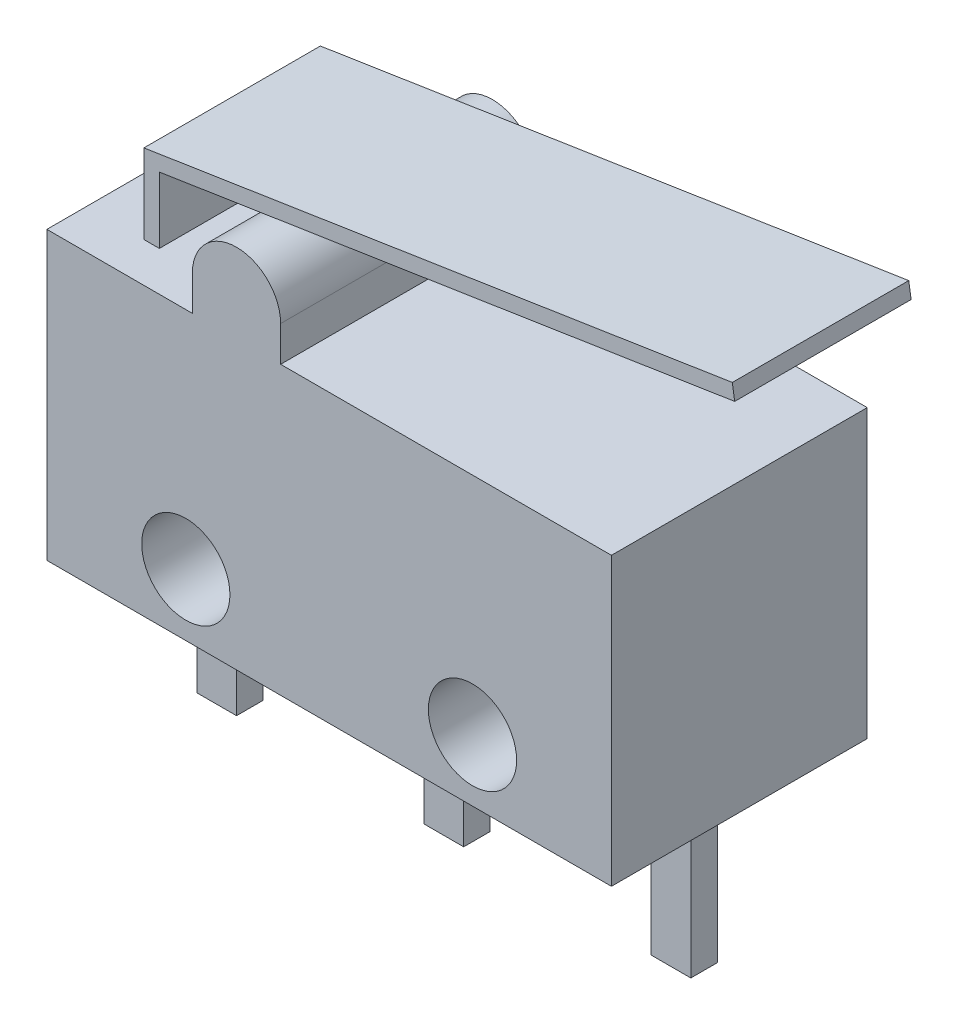
ISO-10303-21;
HEADER;
FILE_DESCRIPTION(('STEP AP214'),'2;1');
FILE_NAME('part.step','',(''),(''),'','','');
FILE_SCHEMA(('AUTOMOTIVE_DESIGN { 1 0 10303 214 1 1 1 1 }'));
ENDSEC;
DATA;
#1=APPLICATION_CONTEXT('core data for automotive mechanical design processes');
#2=APPLICATION_PROTOCOL_DEFINITION('international standard','automotive_design',2000,#1);
#3=PRODUCT_CONTEXT('',#1,'mechanical');
#4=PRODUCT('Part','Part','',(#3));
#5=PRODUCT_RELATED_PRODUCT_CATEGORY('part','',(#4));
#6=PRODUCT_DEFINITION_FORMATION('','',#4);
#7=PRODUCT_DEFINITION_CONTEXT('part definition',#1,'design');
#8=PRODUCT_DEFINITION('design','',#6,#7);
#9=PRODUCT_DEFINITION_SHAPE('','',#8);
#10=(LENGTH_UNIT() NAMED_UNIT(*) SI_UNIT(.MILLI.,.METRE.));
#11=(NAMED_UNIT(*) PLANE_ANGLE_UNIT() SI_UNIT($,.RADIAN.));
#12=(NAMED_UNIT(*) SI_UNIT($,.STERADIAN.) SOLID_ANGLE_UNIT());
#13=UNCERTAINTY_MEASURE_WITH_UNIT(LENGTH_MEASURE(1.E-05),#10,'distance_accuracy_value','');
#14=(GEOMETRIC_REPRESENTATION_CONTEXT(3) GLOBAL_UNCERTAINTY_ASSIGNED_CONTEXT((#13)) GLOBAL_UNIT_ASSIGNED_CONTEXT((#10,
#11,#12)) REPRESENTATION_CONTEXT('',''));
#15=CARTESIAN_POINT('',(0.,0.,0.));
#16=DIRECTION('',(0.,0.,1.));
#17=DIRECTION('',(1.,0.,0.));
#18=AXIS2_PLACEMENT_3D('',#15,#16,#17);
#19=CARTESIAN_POINT('',(0.,6.5,0.));
#20=DIRECTION('',(0.,-1.,0.));
#21=DIRECTION('',(0.,0.,-1.));
#22=AXIS2_PLACEMENT_3D('',#19,#20,#21);
#23=PLANE('',#22);
#24=DIRECTION('',(0.,0.,1.));
#25=VECTOR('',#24,1.);
#26=CARTESIAN_POINT('',(-3.1,6.5,-2.9));
#27=LINE('',#26,#25);
#28=CARTESIAN_POINT('',(-3.1,6.5,-2.9));
#29=VERTEX_POINT('',#28);
#30=CARTESIAN_POINT('',(-3.1,6.5,2.9));
#31=VERTEX_POINT('',#30);
#32=EDGE_CURVE('E270',#29,#31,#27,.T.);
#33=ORIENTED_EDGE('',*,*,#32,.F.);
#34=DIRECTION('',(-1.,0.,0.));
#35=VECTOR('',#34,1.);
#36=CARTESIAN_POINT('',(-6.4,6.5,-2.9));
#37=LINE('',#36,#35);
#38=CARTESIAN_POINT('',(-6.4,6.5,-2.9));
#39=VERTEX_POINT('',#38);
#40=EDGE_CURVE('E425',#29,#39,#37,.T.);
#41=ORIENTED_EDGE('',*,*,#40,.T.);
#42=DIRECTION('',(0.,0.,1.));
#43=VECTOR('',#42,1.);
#44=CARTESIAN_POINT('',(-6.4,6.5,2.9));
#45=LINE('',#44,#43);
#46=CARTESIAN_POINT('',(-6.4,6.5,2.9));
#47=VERTEX_POINT('',#46);
#48=EDGE_CURVE('E431',#39,#47,#45,.T.);
#49=ORIENTED_EDGE('',*,*,#48,.T.);
#50=DIRECTION('',(1.,0.,0.));
#51=VECTOR('',#50,1.);
#52=CARTESIAN_POINT('',(-6.4,6.5,2.9));
#53=LINE('',#52,#51);
#54=EDGE_CURVE('E435',#47,#31,#53,.T.);
#55=ORIENTED_EDGE('',*,*,#54,.T.);
#56=EDGE_LOOP('',(#33,#41,#49,#55));
#57=FACE_BOUND('',#56,.T.);
#58=DIRECTION('',(1.,0.,0.));
#59=VECTOR('',#58,1.);
#60=CARTESIAN_POINT('',(-4.75,6.5,2.));
#61=LINE('',#60,#59);
#62=CARTESIAN_POINT('',(-5.1,6.5,2.));
#63=VERTEX_POINT('',#62);
#64=CARTESIAN_POINT('',(-4.75,6.5,2.));
#65=VERTEX_POINT('',#64);
#66=EDGE_CURVE('E226',#63,#65,#61,.T.);
#67=ORIENTED_EDGE('',*,*,#66,.F.);
#68=DIRECTION('',(0.,0.,-1.));
#69=VECTOR('',#68,1.);
#70=CARTESIAN_POINT('',(-5.1,6.5,2.));
#71=LINE('',#70,#69);
#72=CARTESIAN_POINT('',(-5.1,6.5,-2.));
#73=VERTEX_POINT('',#72);
#74=EDGE_CURVE('E843',#63,#73,#71,.T.);
#75=ORIENTED_EDGE('',*,*,#74,.T.);
#76=DIRECTION('',(1.,0.,0.));
#77=VECTOR('',#76,1.);
#78=CARTESIAN_POINT('',(-4.75,6.5,-2.));
#79=LINE('',#78,#77);
#80=CARTESIAN_POINT('',(-4.75,6.5,-2.));
#81=VERTEX_POINT('',#80);
#82=EDGE_CURVE('E240',#73,#81,#79,.T.);
#83=ORIENTED_EDGE('',*,*,#82,.T.);
#84=DIRECTION('',(0.,0.,-1.));
#85=VECTOR('',#84,1.);
#86=CARTESIAN_POINT('',(-4.75,6.5,2.));
#87=LINE('',#86,#85);
#88=EDGE_CURVE('E61',#65,#81,#87,.T.);
#89=ORIENTED_EDGE('',*,*,#88,.F.);
#90=EDGE_LOOP('',(#67,#75,#83,#89));
#91=FACE_BOUND('',#90,.T.);
#92=ADVANCED_FACE('F45',(#57,#91),#23,.F.);
#93=CARTESIAN_POINT('',(0.,0.,0.));
#94=DIRECTION('',(0.,-1.,0.));
#95=DIRECTION('',(0.,0.,-1.));
#96=AXIS2_PLACEMENT_3D('',#93,#94,#95);
#97=PLANE('',#96);
#98=DIRECTION('',(0.,0.,-1.));
#99=VECTOR('',#98,1.);
#100=CARTESIAN_POINT('',(6.4,0.,2.9));
#101=LINE('',#100,#99);
#102=CARTESIAN_POINT('',(6.4,0.,2.9));
#103=VERTEX_POINT('',#102);
#104=CARTESIAN_POINT('',(6.4,0.,-2.9));
#105=VERTEX_POINT('',#104);
#106=EDGE_CURVE('E420',#103,#105,#101,.T.);
#107=ORIENTED_EDGE('',*,*,#106,.F.);
#108=DIRECTION('',(1.,0.,0.));
#109=VECTOR('',#108,1.);
#110=CARTESIAN_POINT('',(-6.4,0.,2.9));
#111=LINE('',#110,#109);
#112=CARTESIAN_POINT('',(-6.4,0.,2.9));
#113=VERTEX_POINT('',#112);
#114=EDGE_CURVE('E426',#113,#103,#111,.T.);
#115=ORIENTED_EDGE('',*,*,#114,.F.);
#116=DIRECTION('',(0.,0.,1.));
#117=VECTOR('',#116,1.);
#118=CARTESIAN_POINT('',(-6.4,0.,2.9));
#119=LINE('',#118,#117);
#120=CARTESIAN_POINT('',(-6.4,0.,-2.9));
#121=VERTEX_POINT('',#120);
#122=EDGE_CURVE('E446',#121,#113,#119,.T.);
#123=ORIENTED_EDGE('',*,*,#122,.F.);
#124=DIRECTION('',(-1.,0.,0.));
#125=VECTOR('',#124,1.);
#126=CARTESIAN_POINT('',(-6.4,0.,-2.9));
#127=LINE('',#126,#125);
#128=EDGE_CURVE('E443',#105,#121,#127,.T.);
#129=ORIENTED_EDGE('',*,*,#128,.F.);
#130=EDGE_LOOP('',(#107,#115,#123,#129));
#131=FACE_BOUND('',#130,.T.);
#132=DIRECTION('',(1.,0.,0.));
#133=VECTOR('',#132,1.);
#134=CARTESIAN_POINT('',(4.7,0.,-0.299999999999999));
#135=LINE('',#134,#133);
#136=CARTESIAN_POINT('',(4.7,0.,-0.299999999999999));
#137=VERTEX_POINT('',#136);
#138=CARTESIAN_POINT('',(5.6,0.,-0.299999999999999));
#139=VERTEX_POINT('',#138);
#140=EDGE_CURVE('E388',#137,#139,#135,.T.);
#141=ORIENTED_EDGE('',*,*,#140,.F.);
#142=DIRECTION('',(0.,0.,-1.));
#143=VECTOR('',#142,1.);
#144=CARTESIAN_POINT('',(4.7,0.,0.300000000000001));
#145=LINE('',#144,#143);
#146=CARTESIAN_POINT('',(4.7,0.,0.300000000000001));
#147=VERTEX_POINT('',#146);
#148=EDGE_CURVE('E329',#147,#137,#145,.T.);
#149=ORIENTED_EDGE('',*,*,#148,.F.);
#150=DIRECTION('',(-1.,0.,0.));
#151=VECTOR('',#150,1.);
#152=CARTESIAN_POINT('',(4.7,0.,0.300000000000001));
#153=LINE('',#152,#151);
#154=CARTESIAN_POINT('',(5.6,0.,0.300000000000001));
#155=VERTEX_POINT('',#154);
#156=EDGE_CURVE('E380',#155,#147,#153,.T.);
#157=ORIENTED_EDGE('',*,*,#156,.F.);
#158=DIRECTION('',(0.,0.,1.));
#159=VECTOR('',#158,1.);
#160=CARTESIAN_POINT('',(5.6,0.,0.300000000000001));
#161=LINE('',#160,#159);
#162=EDGE_CURVE('E383',#139,#155,#161,.T.);
#163=ORIENTED_EDGE('',*,*,#162,.F.);
#164=EDGE_LOOP('',(#141,#149,#157,#163));
#165=FACE_BOUND('',#164,.T.);
#166=DIRECTION('',(-1.,0.,0.));
#167=VECTOR('',#166,1.);
#168=CARTESIAN_POINT('',(0.45,0.,0.3));
#169=LINE('',#168,#167);
#170=CARTESIAN_POINT('',(0.45,0.,0.3));
#171=VERTEX_POINT('',#170);
#172=CARTESIAN_POINT('',(-0.45,0.,0.3));
#173=VERTEX_POINT('',#172);
#174=EDGE_CURVE('E349',#171,#173,#169,.T.);
#175=ORIENTED_EDGE('',*,*,#174,.F.);
#176=DIRECTION('',(0.,0.,1.));
#177=VECTOR('',#176,1.);
#178=CARTESIAN_POINT('',(0.45,0.,0.3));
#179=LINE('',#178,#177);
#180=CARTESIAN_POINT('',(0.45,0.,-0.3));
#181=VERTEX_POINT('',#180);
#182=EDGE_CURVE('E302',#181,#171,#179,.T.);
#183=ORIENTED_EDGE('',*,*,#182,.F.);
#184=DIRECTION('',(1.,0.,0.));
#185=VECTOR('',#184,1.);
#186=CARTESIAN_POINT('',(0.45,0.,-0.3));
#187=LINE('',#186,#185);
#188=CARTESIAN_POINT('',(-0.45,0.,-0.3));
#189=VERTEX_POINT('',#188);
#190=EDGE_CURVE('E341',#189,#181,#187,.T.);
#191=ORIENTED_EDGE('',*,*,#190,.F.);
#192=DIRECTION('',(0.,0.,-1.));
#193=VECTOR('',#192,1.);
#194=CARTESIAN_POINT('',(-0.45,0.,0.3));
#195=LINE('',#194,#193);
#196=EDGE_CURVE('E344',#173,#189,#195,.T.);
#197=ORIENTED_EDGE('',*,*,#196,.F.);
#198=EDGE_LOOP('',(#175,#183,#191,#197));
#199=FACE_BOUND('',#198,.T.);
#200=DIRECTION('',(-1.,0.,0.));
#201=VECTOR('',#200,1.);
#202=CARTESIAN_POINT('',(-4.7,0.,0.3));
#203=LINE('',#202,#201);
#204=CARTESIAN_POINT('',(-4.7,0.,0.3));
#205=VERTEX_POINT('',#204);
#206=CARTESIAN_POINT('',(-5.6,0.,0.3));
#207=VERTEX_POINT('',#206);
#208=EDGE_CURVE('E301',#205,#207,#203,.T.);
#209=ORIENTED_EDGE('',*,*,#208,.F.);
#210=DIRECTION('',(0.,0.,1.));
#211=VECTOR('',#210,1.);
#212=CARTESIAN_POINT('',(-4.7,0.,0.3));
#213=LINE('',#212,#211);
#214=CARTESIAN_POINT('',(-4.7,0.,-0.3));
#215=VERTEX_POINT('',#214);
#216=EDGE_CURVE('E297',#215,#205,#213,.T.);
#217=ORIENTED_EDGE('',*,*,#216,.F.);
#218=DIRECTION('',(1.,0.,0.));
#219=VECTOR('',#218,1.);
#220=CARTESIAN_POINT('',(-4.7,0.,-0.3));
#221=LINE('',#220,#219);
#222=CARTESIAN_POINT('',(-5.6,0.,-0.3));
#223=VERTEX_POINT('',#222);
#224=EDGE_CURVE('E287',#223,#215,#221,.T.);
#225=ORIENTED_EDGE('',*,*,#224,.F.);
#226=DIRECTION('',(0.,0.,-1.));
#227=VECTOR('',#226,1.);
#228=CARTESIAN_POINT('',(-5.6,0.,0.3));
#229=LINE('',#228,#227);
#230=EDGE_CURVE('E305',#207,#223,#229,.T.);
#231=ORIENTED_EDGE('',*,*,#230,.F.);
#232=EDGE_LOOP('',(#209,#217,#225,#231));
#233=FACE_BOUND('',#232,.T.);
#234=ADVANCED_FACE('F470',(#131,#165,#199,#233),#97,.T.);
#235=CARTESIAN_POINT('',(6.4,6.5,2.9));
#236=DIRECTION('',(-1.,0.,0.));
#237=DIRECTION('',(0.,0.,1.));
#238=AXIS2_PLACEMENT_3D('',#235,#236,#237);
#239=PLANE('',#238);
#240=ORIENTED_EDGE('',*,*,#106,.T.);
#241=DIRECTION('',(0.,-1.,0.));
#242=VECTOR('',#241,1.);
#243=CARTESIAN_POINT('',(6.4,6.5,-2.9));
#244=LINE('',#243,#242);
#245=CARTESIAN_POINT('',(6.4,6.5,-2.9));
#246=VERTEX_POINT('',#245);
#247=EDGE_CURVE('E11',#246,#105,#244,.T.);
#248=ORIENTED_EDGE('',*,*,#247,.F.);
#249=DIRECTION('',(0.,0.,-1.));
#250=VECTOR('',#249,1.);
#251=CARTESIAN_POINT('',(6.4,6.5,2.9));
#252=LINE('',#251,#250);
#253=CARTESIAN_POINT('',(6.4,6.5,2.9));
#254=VERTEX_POINT('',#253);
#255=EDGE_CURVE('E421',#254,#246,#252,.T.);
#256=ORIENTED_EDGE('',*,*,#255,.F.);
#257=DIRECTION('',(0.,-1.,0.));
#258=VECTOR('',#257,1.);
#259=CARTESIAN_POINT('',(6.4,6.5,2.9));
#260=LINE('',#259,#258);
#261=EDGE_CURVE('E439',#254,#103,#260,.T.);
#262=ORIENTED_EDGE('',*,*,#261,.T.);
#263=EDGE_LOOP('',(#240,#248,#256,#262));
#264=FACE_BOUND('',#263,.T.);
#265=ADVANCED_FACE('F47',(#264),#239,.F.);
#266=CARTESIAN_POINT('',(-6.4,6.5,-2.9));
#267=DIRECTION('',(0.,0.,1.));
#268=DIRECTION('',(1.,0.,0.));
#269=AXIS2_PLACEMENT_3D('',#266,#267,#268);
#270=PLANE('',#269);
#271=CARTESIAN_POINT('',(-3.25,1.4,-2.9));
#272=DIRECTION('',(0.,0.,1.));
#273=DIRECTION('',(1.,0.,0.));
#274=AXIS2_PLACEMENT_3D('',#271,#272,#273);
#275=CIRCLE('',#274,1.);
#276=CARTESIAN_POINT('',(-2.25,1.4,-2.9));
#277=VERTEX_POINT('',#276);
#278=EDGE_CURVE('E416',#277,#277,#275,.T.);
#279=ORIENTED_EDGE('',*,*,#278,.T.);
#280=EDGE_LOOP('',(#279));
#281=FACE_BOUND('',#280,.T.);
#282=CARTESIAN_POINT('',(3.25,1.4,-2.9));
#283=DIRECTION('',(0.,0.,1.));
#284=DIRECTION('',(1.,0.,0.));
#285=AXIS2_PLACEMENT_3D('',#282,#283,#284);
#286=CIRCLE('',#285,1.);
#287=CARTESIAN_POINT('',(4.25,1.4,-2.9));
#288=VERTEX_POINT('',#287);
#289=EDGE_CURVE('E409',#288,#288,#286,.T.);
#290=ORIENTED_EDGE('',*,*,#289,.T.);
#291=EDGE_LOOP('',(#290));
#292=FACE_BOUND('',#291,.T.);
#293=ORIENTED_EDGE('',*,*,#128,.T.);
#294=DIRECTION('',(0.,-1.,0.));
#295=VECTOR('',#294,1.);
#296=CARTESIAN_POINT('',(-6.4,6.5,-2.9));
#297=LINE('',#296,#295);
#298=EDGE_CURVE('E54',#39,#121,#297,.T.);
#299=ORIENTED_EDGE('',*,*,#298,.F.);
#300=ORIENTED_EDGE('',*,*,#40,.F.);
#301=DIRECTION('',(0.,-1.,0.));
#302=VECTOR('',#301,1.);
#303=CARTESIAN_POINT('',(-3.1,6.5,-2.9));
#304=LINE('',#303,#302);
#305=CARTESIAN_POINT('',(-3.1,7.3,-2.9));
#306=VERTEX_POINT('',#305);
#307=EDGE_CURVE('E260',#306,#29,#304,.T.);
#308=ORIENTED_EDGE('',*,*,#307,.F.);
#309=CARTESIAN_POINT('',(-2.1,7.3,-2.9));
#310=DIRECTION('',(0.,0.,1.));
#311=DIRECTION('',(1.,0.,0.));
#312=AXIS2_PLACEMENT_3D('',#309,#310,#311);
#313=CIRCLE('',#312,1.);
#314=CARTESIAN_POINT('',(-1.1,7.3,-2.9));
#315=VERTEX_POINT('',#314);
#316=EDGE_CURVE('E255',#315,#306,#313,.T.);
#317=ORIENTED_EDGE('',*,*,#316,.F.);
#318=DIRECTION('',(0.,1.,0.));
#319=VECTOR('',#318,1.);
#320=CARTESIAN_POINT('',(-1.1,7.3,-2.9));
#321=LINE('',#320,#319);
#322=CARTESIAN_POINT('',(-1.1,6.5,-2.9));
#323=VERTEX_POINT('',#322);
#324=EDGE_CURVE('E251',#323,#315,#321,.T.);
#325=ORIENTED_EDGE('',*,*,#324,.F.);
#326=EDGE_CURVE('E427',#246,#323,#37,.T.);
#327=ORIENTED_EDGE('',*,*,#326,.F.);
#328=ORIENTED_EDGE('',*,*,#247,.T.);
#329=EDGE_LOOP('',(#293,#299,#300,#308,#317,#325,#327,#328));
#330=FACE_BOUND('',#329,.T.);
#331=ADVANCED_FACE('F487',(#281,#292,#330),#270,.F.);
#332=CARTESIAN_POINT('',(-6.4,6.5,2.9));
#333=DIRECTION('',(1.,0.,0.));
#334=DIRECTION('',(0.,0.,-1.));
#335=AXIS2_PLACEMENT_3D('',#332,#333,#334);
#336=PLANE('',#335);
#337=ORIENTED_EDGE('',*,*,#122,.T.);
#338=DIRECTION('',(0.,-1.,0.));
#339=VECTOR('',#338,1.);
#340=CARTESIAN_POINT('',(-6.4,6.5,2.9));
#341=LINE('',#340,#339);
#342=EDGE_CURVE('E454',#47,#113,#341,.T.);
#343=ORIENTED_EDGE('',*,*,#342,.F.);
#344=ORIENTED_EDGE('',*,*,#48,.F.);
#345=ORIENTED_EDGE('',*,*,#298,.T.);
#346=EDGE_LOOP('',(#337,#343,#344,#345));
#347=FACE_BOUND('',#346,.T.);
#348=ADVANCED_FACE('F463',(#347),#336,.F.);
#349=CARTESIAN_POINT('',(-6.4,6.5,2.9));
#350=DIRECTION('',(0.,0.,-1.));
#351=DIRECTION('',(-1.,0.,0.));
#352=AXIS2_PLACEMENT_3D('',#349,#350,#351);
#353=PLANE('',#352);
#354=CARTESIAN_POINT('',(-3.25,1.4,2.9));
#355=DIRECTION('',(0.,0.,1.));
#356=DIRECTION('',(1.,0.,0.));
#357=AXIS2_PLACEMENT_3D('',#354,#355,#356);
#358=CIRCLE('',#357,1.);
#359=CARTESIAN_POINT('',(-2.25,1.4,2.9));
#360=VERTEX_POINT('',#359);
#361=EDGE_CURVE('E405',#360,#360,#358,.T.);
#362=ORIENTED_EDGE('',*,*,#361,.F.);
#363=EDGE_LOOP('',(#362));
#364=FACE_BOUND('',#363,.T.);
#365=CARTESIAN_POINT('',(3.25,1.4,2.9));
#366=DIRECTION('',(0.,0.,1.));
#367=DIRECTION('',(-1.,0.,0.));
#368=AXIS2_PLACEMENT_3D('',#365,#366,#367);
#369=CIRCLE('',#368,1.);
#370=CARTESIAN_POINT('',(2.25,1.4,2.9));
#371=VERTEX_POINT('',#370);
#372=EDGE_CURVE('E324',#371,#371,#369,.T.);
#373=ORIENTED_EDGE('',*,*,#372,.F.);
#374=EDGE_LOOP('',(#373));
#375=FACE_BOUND('',#374,.T.);
#376=ORIENTED_EDGE('',*,*,#114,.T.);
#377=ORIENTED_EDGE('',*,*,#261,.F.);
#378=CARTESIAN_POINT('',(-1.1,6.5,2.9));
#379=VERTEX_POINT('',#378);
#380=EDGE_CURVE('E434',#379,#254,#53,.T.);
#381=ORIENTED_EDGE('',*,*,#380,.F.);
#382=DIRECTION('',(0.,1.,0.));
#383=VECTOR('',#382,1.);
#384=CARTESIAN_POINT('',(-1.1,7.3,2.9));
#385=LINE('',#384,#383);
#386=CARTESIAN_POINT('',(-1.1,7.3,2.9));
#387=VERTEX_POINT('',#386);
#388=EDGE_CURVE('E69',#379,#387,#385,.T.);
#389=ORIENTED_EDGE('',*,*,#388,.T.);
#390=CARTESIAN_POINT('',(-2.1,7.3,2.9));
#391=DIRECTION('',(0.,0.,1.));
#392=DIRECTION('',(1.,0.,0.));
#393=AXIS2_PLACEMENT_3D('',#390,#391,#392);
#394=CIRCLE('',#393,1.);
#395=CARTESIAN_POINT('',(-3.1,7.3,2.9));
#396=VERTEX_POINT('',#395);
#397=EDGE_CURVE('E245',#387,#396,#394,.T.);
#398=ORIENTED_EDGE('',*,*,#397,.T.);
#399=DIRECTION('',(0.,-1.,0.));
#400=VECTOR('',#399,1.);
#401=CARTESIAN_POINT('',(-3.1,6.5,2.9));
#402=LINE('',#401,#400);
#403=EDGE_CURVE('E256',#396,#31,#402,.T.);
#404=ORIENTED_EDGE('',*,*,#403,.T.);
#405=ORIENTED_EDGE('',*,*,#54,.F.);
#406=ORIENTED_EDGE('',*,*,#342,.T.);
#407=EDGE_LOOP('',(#376,#377,#381,#389,#398,#404,#405,#406));
#408=FACE_BOUND('',#407,.T.);
#409=ADVANCED_FACE('F474',(#364,#375,#408),#353,.F.);
#410=ORIENTED_EDGE('',*,*,#326,.T.);
#411=DIRECTION('',(0.,0.,1.));
#412=VECTOR('',#411,1.);
#413=CARTESIAN_POINT('',(-1.1,6.5,-2.9));
#414=LINE('',#413,#412);
#415=EDGE_CURVE('E262',#323,#379,#414,.T.);
#416=ORIENTED_EDGE('',*,*,#415,.T.);
#417=ORIENTED_EDGE('',*,*,#380,.T.);
#418=ORIENTED_EDGE('',*,*,#255,.T.);
#419=EDGE_LOOP('',(#410,#416,#417,#418));
#420=FACE_BOUND('',#419,.T.);
#421=ADVANCED_FACE('F481',(#420),#23,.F.);
#422=CARTESIAN_POINT('',(3.25,1.4,-13.6));
#423=DIRECTION('',(0.,0.,1.));
#424=DIRECTION('',(1.,0.,0.));
#425=AXIS2_PLACEMENT_3D('',#422,#423,#424);
#426=CYLINDRICAL_SURFACE('',#425,1.);
#427=ORIENTED_EDGE('',*,*,#372,.T.);
#428=EDGE_LOOP('',(#427));
#429=FACE_BOUND('',#428,.T.);
#430=ORIENTED_EDGE('',*,*,#289,.F.);
#431=EDGE_LOOP('',(#430));
#432=FACE_BOUND('',#431,.T.);
#433=ADVANCED_FACE('F515',(#429,#432),#426,.F.);
#434=CARTESIAN_POINT('',(-3.25,1.4,-13.6));
#435=DIRECTION('',(0.,0.,1.));
#436=DIRECTION('',(1.,0.,0.));
#437=AXIS2_PLACEMENT_3D('',#434,#435,#436);
#438=CYLINDRICAL_SURFACE('',#437,1.);
#439=ORIENTED_EDGE('',*,*,#361,.T.);
#440=EDGE_LOOP('',(#439));
#441=FACE_BOUND('',#440,.T.);
#442=ORIENTED_EDGE('',*,*,#278,.F.);
#443=EDGE_LOOP('',(#442));
#444=FACE_BOUND('',#443,.T.);
#445=ADVANCED_FACE('F521',(#441,#444),#438,.F.);
#446=CARTESIAN_POINT('',(4.7,-3.5,0.300000000000001));
#447=DIRECTION('',(1.,0.,0.));
#448=DIRECTION('',(0.,0.,-1.));
#449=AXIS2_PLACEMENT_3D('',#446,#447,#448);
#450=PLANE('',#449);
#451=ORIENTED_EDGE('',*,*,#148,.T.);
#452=DIRECTION('',(0.,1.,0.));
#453=VECTOR('',#452,1.);
#454=CARTESIAN_POINT('',(4.7,-3.5,-0.299999999999999));
#455=LINE('',#454,#453);
#456=CARTESIAN_POINT('',(4.7,-3.5,-0.299999999999999));
#457=VERTEX_POINT('',#456);
#458=EDGE_CURVE('E273',#457,#137,#455,.T.);
#459=ORIENTED_EDGE('',*,*,#458,.F.);
#460=DIRECTION('',(0.,0.,-1.));
#461=VECTOR('',#460,1.);
#462=CARTESIAN_POINT('',(4.7,-3.5,0.300000000000001));
#463=LINE('',#462,#461);
#464=CARTESIAN_POINT('',(4.7,-3.5,0.300000000000001));
#465=VERTEX_POINT('',#464);
#466=EDGE_CURVE('E384',#465,#457,#463,.T.);
#467=ORIENTED_EDGE('',*,*,#466,.F.);
#468=DIRECTION('',(0.,1.,0.));
#469=VECTOR('',#468,1.);
#470=CARTESIAN_POINT('',(4.7,-3.5,0.300000000000001));
#471=LINE('',#470,#469);
#472=EDGE_CURVE('E375',#465,#147,#471,.T.);
#473=ORIENTED_EDGE('',*,*,#472,.T.);
#474=EDGE_LOOP('',(#451,#459,#467,#473));
#475=FACE_BOUND('',#474,.T.);
#476=ADVANCED_FACE('F543',(#475),#450,.F.);
#477=CARTESIAN_POINT('',(4.7,-3.5,-0.299999999999999));
#478=DIRECTION('',(0.,0.,1.));
#479=DIRECTION('',(1.,0.,0.));
#480=AXIS2_PLACEMENT_3D('',#477,#478,#479);
#481=PLANE('',#480);
#482=ORIENTED_EDGE('',*,*,#140,.T.);
#483=DIRECTION('',(0.,1.,0.));
#484=VECTOR('',#483,1.);
#485=CARTESIAN_POINT('',(5.6,-3.5,-0.299999999999999));
#486=LINE('',#485,#484);
#487=CARTESIAN_POINT('',(5.6,-3.5,-0.299999999999999));
#488=VERTEX_POINT('',#487);
#489=EDGE_CURVE('E368',#488,#139,#486,.T.);
#490=ORIENTED_EDGE('',*,*,#489,.F.);
#491=DIRECTION('',(1.,0.,0.));
#492=VECTOR('',#491,1.);
#493=CARTESIAN_POINT('',(4.7,-3.5,-0.299999999999999));
#494=LINE('',#493,#492);
#495=EDGE_CURVE('E399',#457,#488,#494,.T.);
#496=ORIENTED_EDGE('',*,*,#495,.F.);
#497=ORIENTED_EDGE('',*,*,#458,.T.);
#498=EDGE_LOOP('',(#482,#490,#496,#497));
#499=FACE_BOUND('',#498,.T.);
#500=ADVANCED_FACE('F549',(#499),#481,.F.);
#501=CARTESIAN_POINT('',(5.6,-3.5,0.300000000000001));
#502=DIRECTION('',(-1.,0.,0.));
#503=DIRECTION('',(0.,0.,1.));
#504=AXIS2_PLACEMENT_3D('',#501,#502,#503);
#505=PLANE('',#504);
#506=ORIENTED_EDGE('',*,*,#162,.T.);
#507=DIRECTION('',(0.,1.,0.));
#508=VECTOR('',#507,1.);
#509=CARTESIAN_POINT('',(5.6,-3.5,0.300000000000001));
#510=LINE('',#509,#508);
#511=CARTESIAN_POINT('',(5.6,-3.5,0.300000000000001));
#512=VERTEX_POINT('',#511);
#513=EDGE_CURVE('E372',#512,#155,#510,.T.);
#514=ORIENTED_EDGE('',*,*,#513,.F.);
#515=DIRECTION('',(0.,0.,1.));
#516=VECTOR('',#515,1.);
#517=CARTESIAN_POINT('',(5.6,-3.5,0.300000000000001));
#518=LINE('',#517,#516);
#519=EDGE_CURVE('E396',#488,#512,#518,.T.);
#520=ORIENTED_EDGE('',*,*,#519,.F.);
#521=ORIENTED_EDGE('',*,*,#489,.T.);
#522=EDGE_LOOP('',(#506,#514,#520,#521));
#523=FACE_BOUND('',#522,.T.);
#524=ADVANCED_FACE('F561',(#523),#505,.F.);
#525=CARTESIAN_POINT('',(4.7,-3.5,0.300000000000001));
#526=DIRECTION('',(0.,0.,-1.));
#527=DIRECTION('',(-1.,0.,0.));
#528=AXIS2_PLACEMENT_3D('',#525,#526,#527);
#529=PLANE('',#528);
#530=ORIENTED_EDGE('',*,*,#156,.T.);
#531=ORIENTED_EDGE('',*,*,#472,.F.);
#532=DIRECTION('',(-1.,0.,0.));
#533=VECTOR('',#532,1.);
#534=CARTESIAN_POINT('',(4.7,-3.5,0.300000000000001));
#535=LINE('',#534,#533);
#536=EDGE_CURVE('E379',#512,#465,#535,.T.);
#537=ORIENTED_EDGE('',*,*,#536,.F.);
#538=ORIENTED_EDGE('',*,*,#513,.T.);
#539=EDGE_LOOP('',(#530,#531,#537,#538));
#540=FACE_BOUND('',#539,.T.);
#541=ADVANCED_FACE('F557',(#540),#529,.F.);
#542=CARTESIAN_POINT('',(0.,-3.5,0.));
#543=DIRECTION('',(0.,-1.,0.));
#544=DIRECTION('',(0.,0.,-1.));
#545=AXIS2_PLACEMENT_3D('',#542,#543,#544);
#546=PLANE('',#545);
#547=ORIENTED_EDGE('',*,*,#466,.T.);
#548=ORIENTED_EDGE('',*,*,#495,.T.);
#549=ORIENTED_EDGE('',*,*,#519,.T.);
#550=ORIENTED_EDGE('',*,*,#536,.T.);
#551=EDGE_LOOP('',(#547,#548,#549,#550));
#552=FACE_BOUND('',#551,.T.);
#553=ADVANCED_FACE('F553',(#552),#546,.T.);
#554=CARTESIAN_POINT('',(0.45,-3.5,0.3));
#555=DIRECTION('',(-1.,0.,0.));
#556=DIRECTION('',(0.,0.,1.));
#557=AXIS2_PLACEMENT_3D('',#554,#555,#556);
#558=PLANE('',#557);
#559=ORIENTED_EDGE('',*,*,#182,.T.);
#560=DIRECTION('',(0.,1.,0.));
#561=VECTOR('',#560,1.);
#562=CARTESIAN_POINT('',(0.45,-3.5,0.3));
#563=LINE('',#562,#561);
#564=CARTESIAN_POINT('',(0.45,-3.5,0.3));
#565=VERTEX_POINT('',#564);
#566=EDGE_CURVE('E325',#565,#171,#563,.T.);
#567=ORIENTED_EDGE('',*,*,#566,.F.);
#568=DIRECTION('',(0.,0.,1.));
#569=VECTOR('',#568,1.);
#570=CARTESIAN_POINT('',(0.45,-3.5,0.3));
#571=LINE('',#570,#569);
#572=CARTESIAN_POINT('',(0.45,-3.5,-0.3));
#573=VERTEX_POINT('',#572);
#574=EDGE_CURVE('E345',#573,#565,#571,.T.);
#575=ORIENTED_EDGE('',*,*,#574,.F.);
#576=DIRECTION('',(0.,1.,0.));
#577=VECTOR('',#576,1.);
#578=CARTESIAN_POINT('',(0.45,-3.5,-0.3));
#579=LINE('',#578,#577);
#580=EDGE_CURVE('E336',#573,#181,#579,.T.);
#581=ORIENTED_EDGE('',*,*,#580,.T.);
#582=EDGE_LOOP('',(#559,#567,#575,#581));
#583=FACE_BOUND('',#582,.T.);
#584=ADVANCED_FACE('F556',(#583),#558,.F.);
#585=CARTESIAN_POINT('',(0.45,-3.5,0.3));
#586=DIRECTION('',(0.,0.,-1.));
#587=DIRECTION('',(-1.,0.,0.));
#588=AXIS2_PLACEMENT_3D('',#585,#586,#587);
#589=PLANE('',#588);
#590=ORIENTED_EDGE('',*,*,#174,.T.);
#591=DIRECTION('',(0.,1.,0.));
#592=VECTOR('',#591,1.);
#593=CARTESIAN_POINT('',(-0.45,-3.5,0.3));
#594=LINE('',#593,#592);
#595=CARTESIAN_POINT('',(-0.45,-3.5,0.3));
#596=VERTEX_POINT('',#595);
#597=EDGE_CURVE('E328',#596,#173,#594,.T.);
#598=ORIENTED_EDGE('',*,*,#597,.F.);
#599=DIRECTION('',(-1.,0.,0.));
#600=VECTOR('',#599,1.);
#601=CARTESIAN_POINT('',(0.45,-3.5,0.3));
#602=LINE('',#601,#600);
#603=EDGE_CURVE('E360',#565,#596,#602,.T.);
#604=ORIENTED_EDGE('',*,*,#603,.F.);
#605=ORIENTED_EDGE('',*,*,#566,.T.);
#606=EDGE_LOOP('',(#590,#598,#604,#605));
#607=FACE_BOUND('',#606,.T.);
#608=ADVANCED_FACE('F581',(#607),#589,.F.);
#609=CARTESIAN_POINT('',(-0.45,-3.5,0.3));
#610=DIRECTION('',(1.,0.,0.));
#611=DIRECTION('',(0.,0.,-1.));
#612=AXIS2_PLACEMENT_3D('',#609,#610,#611);
#613=PLANE('',#612);
#614=ORIENTED_EDGE('',*,*,#196,.T.);
#615=DIRECTION('',(0.,1.,0.));
#616=VECTOR('',#615,1.);
#617=CARTESIAN_POINT('',(-0.45,-3.5,-0.3));
#618=LINE('',#617,#616);
#619=CARTESIAN_POINT('',(-0.45,-3.5,-0.3));
#620=VERTEX_POINT('',#619);
#621=EDGE_CURVE('E333',#620,#189,#618,.T.);
#622=ORIENTED_EDGE('',*,*,#621,.F.);
#623=DIRECTION('',(0.,0.,-1.));
#624=VECTOR('',#623,1.);
#625=CARTESIAN_POINT('',(-0.45,-3.5,0.3));
#626=LINE('',#625,#624);
#627=EDGE_CURVE('E357',#596,#620,#626,.T.);
#628=ORIENTED_EDGE('',*,*,#627,.F.);
#629=ORIENTED_EDGE('',*,*,#597,.T.);
#630=EDGE_LOOP('',(#614,#622,#628,#629));
#631=FACE_BOUND('',#630,.T.);
#632=ADVANCED_FACE('F577',(#631),#613,.F.);
#633=CARTESIAN_POINT('',(0.45,-3.5,-0.3));
#634=DIRECTION('',(0.,0.,1.));
#635=DIRECTION('',(1.,0.,0.));
#636=AXIS2_PLACEMENT_3D('',#633,#634,#635);
#637=PLANE('',#636);
#638=ORIENTED_EDGE('',*,*,#190,.T.);
#639=ORIENTED_EDGE('',*,*,#580,.F.);
#640=DIRECTION('',(1.,0.,0.));
#641=VECTOR('',#640,1.);
#642=CARTESIAN_POINT('',(0.45,-3.5,-0.3));
#643=LINE('',#642,#641);
#644=EDGE_CURVE('E340',#620,#573,#643,.T.);
#645=ORIENTED_EDGE('',*,*,#644,.F.);
#646=ORIENTED_EDGE('',*,*,#621,.T.);
#647=EDGE_LOOP('',(#638,#639,#645,#646));
#648=FACE_BOUND('',#647,.T.);
#649=ADVANCED_FACE('F573',(#648),#637,.F.);
#650=CARTESIAN_POINT('',(0.,-3.5,0.));
#651=DIRECTION('',(0.,1.,0.));
#652=DIRECTION('',(0.,0.,1.));
#653=AXIS2_PLACEMENT_3D('',#650,#651,#652);
#654=PLANE('',#653);
#655=ORIENTED_EDGE('',*,*,#574,.T.);
#656=ORIENTED_EDGE('',*,*,#603,.T.);
#657=ORIENTED_EDGE('',*,*,#627,.T.);
#658=ORIENTED_EDGE('',*,*,#644,.T.);
#659=EDGE_LOOP('',(#655,#656,#657,#658));
#660=FACE_BOUND('',#659,.T.);
#661=ADVANCED_FACE('F569',(#660),#654,.F.);
#662=CARTESIAN_POINT('',(-4.7,-3.5,0.3));
#663=DIRECTION('',(-1.,0.,0.));
#664=DIRECTION('',(0.,0.,1.));
#665=AXIS2_PLACEMENT_3D('',#662,#663,#664);
#666=PLANE('',#665);
#667=ORIENTED_EDGE('',*,*,#216,.T.);
#668=DIRECTION('',(0.,1.,0.));
#669=VECTOR('',#668,1.);
#670=CARTESIAN_POINT('',(-4.7,-3.5,0.3));
#671=LINE('',#670,#669);
#672=CARTESIAN_POINT('',(-4.7,-3.5,0.3));
#673=VERTEX_POINT('',#672);
#674=EDGE_CURVE('E321',#673,#205,#671,.T.);
#675=ORIENTED_EDGE('',*,*,#674,.F.);
#676=DIRECTION('',(0.,0.,1.));
#677=VECTOR('',#676,1.);
#678=CARTESIAN_POINT('',(-4.7,-3.5,0.3));
#679=LINE('',#678,#677);
#680=CARTESIAN_POINT('',(-4.7,-3.5,-0.3));
#681=VERTEX_POINT('',#680);
#682=EDGE_CURVE('E282',#681,#673,#679,.T.);
#683=ORIENTED_EDGE('',*,*,#682,.F.);
#684=DIRECTION('',(0.,1.,0.));
#685=VECTOR('',#684,1.);
#686=CARTESIAN_POINT('',(-4.7,-3.5,-0.3));
#687=LINE('',#686,#685);
#688=EDGE_CURVE('E296',#681,#215,#687,.T.);
#689=ORIENTED_EDGE('',*,*,#688,.T.);
#690=EDGE_LOOP('',(#667,#675,#683,#689));
#691=FACE_BOUND('',#690,.T.);
#692=ADVANCED_FACE('F572',(#691),#666,.F.);
#693=CARTESIAN_POINT('',(-4.7,-3.5,0.3));
#694=DIRECTION('',(0.,0.,-1.));
#695=DIRECTION('',(-1.,0.,0.));
#696=AXIS2_PLACEMENT_3D('',#693,#694,#695);
#697=PLANE('',#696);
#698=ORIENTED_EDGE('',*,*,#208,.T.);
#699=DIRECTION('',(0.,1.,0.));
#700=VECTOR('',#699,1.);
#701=CARTESIAN_POINT('',(-5.6,-3.5,0.3));
#702=LINE('',#701,#700);
#703=CARTESIAN_POINT('',(-5.6,-3.5,0.3));
#704=VERTEX_POINT('',#703);
#705=EDGE_CURVE('E317',#704,#207,#702,.T.);
#706=ORIENTED_EDGE('',*,*,#705,.F.);
#707=DIRECTION('',(-1.,0.,0.));
#708=VECTOR('',#707,1.);
#709=CARTESIAN_POINT('',(-4.7,-3.5,0.3));
#710=LINE('',#709,#708);
#711=EDGE_CURVE('E286',#673,#704,#710,.T.);
#712=ORIENTED_EDGE('',*,*,#711,.F.);
#713=ORIENTED_EDGE('',*,*,#674,.T.);
#714=EDGE_LOOP('',(#698,#706,#712,#713));
#715=FACE_BOUND('',#714,.T.);
#716=ADVANCED_FACE('F591',(#715),#697,.F.);
#717=CARTESIAN_POINT('',(-5.6,-3.5,0.3));
#718=DIRECTION('',(1.,0.,0.));
#719=DIRECTION('',(0.,0.,-1.));
#720=AXIS2_PLACEMENT_3D('',#717,#718,#719);
#721=PLANE('',#720);
#722=ORIENTED_EDGE('',*,*,#230,.T.);
#723=DIRECTION('',(0.,1.,0.));
#724=VECTOR('',#723,1.);
#725=CARTESIAN_POINT('',(-5.6,-3.5,-0.3));
#726=LINE('',#725,#724);
#727=CARTESIAN_POINT('',(-5.6,-3.5,-0.3));
#728=VERTEX_POINT('',#727);
#729=EDGE_CURVE('E314',#728,#223,#726,.T.);
#730=ORIENTED_EDGE('',*,*,#729,.F.);
#731=DIRECTION('',(0.,0.,-1.));
#732=VECTOR('',#731,1.);
#733=CARTESIAN_POINT('',(-5.6,-3.5,0.3));
#734=LINE('',#733,#732);
#735=EDGE_CURVE('E290',#704,#728,#734,.T.);
#736=ORIENTED_EDGE('',*,*,#735,.F.);
#737=ORIENTED_EDGE('',*,*,#705,.T.);
#738=EDGE_LOOP('',(#722,#730,#736,#737));
#739=FACE_BOUND('',#738,.T.);
#740=ADVANCED_FACE('F595',(#739),#721,.F.);
#741=CARTESIAN_POINT('',(-4.7,-3.5,-0.3));
#742=DIRECTION('',(0.,0.,1.));
#743=DIRECTION('',(1.,0.,0.));
#744=AXIS2_PLACEMENT_3D('',#741,#742,#743);
#745=PLANE('',#744);
#746=ORIENTED_EDGE('',*,*,#224,.T.);
#747=ORIENTED_EDGE('',*,*,#688,.F.);
#748=DIRECTION('',(1.,0.,0.));
#749=VECTOR('',#748,1.);
#750=CARTESIAN_POINT('',(-4.7,-3.5,-0.3));
#751=LINE('',#750,#749);
#752=EDGE_CURVE('E293',#728,#681,#751,.T.);
#753=ORIENTED_EDGE('',*,*,#752,.F.);
#754=ORIENTED_EDGE('',*,*,#729,.T.);
#755=EDGE_LOOP('',(#746,#747,#753,#754));
#756=FACE_BOUND('',#755,.T.);
#757=ADVANCED_FACE('F599',(#756),#745,.F.);
#758=CARTESIAN_POINT('',(0.,-3.5,0.));
#759=DIRECTION('',(0.,1.,0.));
#760=DIRECTION('',(0.,0.,1.));
#761=AXIS2_PLACEMENT_3D('',#758,#759,#760);
#762=PLANE('',#761);
#763=ORIENTED_EDGE('',*,*,#682,.T.);
#764=ORIENTED_EDGE('',*,*,#711,.T.);
#765=ORIENTED_EDGE('',*,*,#735,.T.);
#766=ORIENTED_EDGE('',*,*,#752,.T.);
#767=EDGE_LOOP('',(#763,#764,#765,#766));
#768=FACE_BOUND('',#767,.T.);
#769=ADVANCED_FACE('F602',(#768),#762,.F.);
#770=CARTESIAN_POINT('',(-3.1,6.5,-2.9));
#771=DIRECTION('',(-1.,0.,0.));
#772=DIRECTION('',(0.,0.,1.));
#773=AXIS2_PLACEMENT_3D('',#770,#771,#772);
#774=PLANE('',#773);
#775=ORIENTED_EDGE('',*,*,#403,.F.);
#776=DIRECTION('',(0.,0.,1.));
#777=VECTOR('',#776,1.);
#778=CARTESIAN_POINT('',(-3.1,7.3,-2.9));
#779=LINE('',#778,#777);
#780=EDGE_CURVE('E274',#306,#396,#779,.T.);
#781=ORIENTED_EDGE('',*,*,#780,.F.);
#782=ORIENTED_EDGE('',*,*,#307,.T.);
#783=ORIENTED_EDGE('',*,*,#32,.T.);
#784=EDGE_LOOP('',(#775,#781,#782,#783));
#785=FACE_BOUND('',#784,.T.);
#786=ADVANCED_FACE('F492',(#785),#774,.T.);
#787=CARTESIAN_POINT('',(-2.1,7.3,-2.9));
#788=DIRECTION('',(0.,0.,1.));
#789=DIRECTION('',(1.,0.,0.));
#790=AXIS2_PLACEMENT_3D('',#787,#788,#789);
#791=CYLINDRICAL_SURFACE('',#790,1.);
#792=ORIENTED_EDGE('',*,*,#397,.F.);
#793=DIRECTION('',(0.,0.,1.));
#794=VECTOR('',#793,1.);
#795=CARTESIAN_POINT('',(-1.1,7.3,-2.9));
#796=LINE('',#795,#794);
#797=EDGE_CURVE('E277',#315,#387,#796,.T.);
#798=ORIENTED_EDGE('',*,*,#797,.F.);
#799=ORIENTED_EDGE('',*,*,#316,.T.);
#800=ORIENTED_EDGE('',*,*,#780,.T.);
#801=EDGE_LOOP('',(#792,#798,#799,#800));
#802=FACE_BOUND('',#801,.T.);
#803=ADVANCED_FACE('F495',(#802),#791,.T.);
#804=CARTESIAN_POINT('',(-1.1,7.3,-2.9));
#805=DIRECTION('',(1.,0.,0.));
#806=DIRECTION('',(0.,0.,-1.));
#807=AXIS2_PLACEMENT_3D('',#804,#805,#806);
#808=PLANE('',#807);
#809=ORIENTED_EDGE('',*,*,#388,.F.);
#810=ORIENTED_EDGE('',*,*,#415,.F.);
#811=ORIENTED_EDGE('',*,*,#324,.T.);
#812=ORIENTED_EDGE('',*,*,#797,.T.);
#813=EDGE_LOOP('',(#809,#810,#811,#812));
#814=FACE_BOUND('',#813,.T.);
#815=ADVANCED_FACE('F496',(#814),#808,.T.);
#816=CARTESIAN_POINT('',(-4.75,8.,2.));
#817=DIRECTION('',(-1.,0.,0.));
#818=DIRECTION('',(0.,0.,1.));
#819=AXIS2_PLACEMENT_3D('',#816,#817,#818);
#820=PLANE('',#819);
#821=DIRECTION('',(0.,1.,0.));
#822=VECTOR('',#821,1.);
#823=CARTESIAN_POINT('',(-4.75,8.,-2.));
#824=LINE('',#823,#822);
#825=CARTESIAN_POINT('',(-4.75,8.,-2.));
#826=VERTEX_POINT('',#825);
#827=EDGE_CURVE('E840',#81,#826,#824,.T.);
#828=ORIENTED_EDGE('',*,*,#827,.T.);
#829=DIRECTION('',(0.,0.,-1.));
#830=VECTOR('',#829,1.);
#831=CARTESIAN_POINT('',(-4.75,8.,2.));
#832=LINE('',#831,#830);
#833=CARTESIAN_POINT('',(-4.75,8.,2.));
#834=VERTEX_POINT('',#833);
#835=EDGE_CURVE('E221',#834,#826,#832,.T.);
#836=ORIENTED_EDGE('',*,*,#835,.F.);
#837=DIRECTION('',(0.,1.,0.));
#838=VECTOR('',#837,1.);
#839=CARTESIAN_POINT('',(-4.75,8.,2.));
#840=LINE('',#839,#838);
#841=EDGE_CURVE('E217',#65,#834,#840,.T.);
#842=ORIENTED_EDGE('',*,*,#841,.F.);
#843=ORIENTED_EDGE('',*,*,#88,.T.);
#844=EDGE_LOOP('',(#828,#836,#842,#843));
#845=FACE_BOUND('',#844,.T.);
#846=ADVANCED_FACE('F219',(#845),#820,.F.);
#847=CARTESIAN_POINT('',(8.29470588235296,10.0188235294116,2.));
#848=DIRECTION('',(-0.152941176470576,0.988235294117649,0.));
#849=DIRECTION('',(-0.988235294117649,-0.152941176470576,0.));
#850=AXIS2_PLACEMENT_3D('',#847,#848,#849);
#851=PLANE('',#850);
#852=DIRECTION('',(0.988235294117649,0.152941176470576,0.));
#853=VECTOR('',#852,1.);
#854=CARTESIAN_POINT('',(8.29470588235296,10.0188235294116,-2.));
#855=LINE('',#854,#853);
#856=CARTESIAN_POINT('',(8.29470588235296,10.0188235294116,-2.));
#857=VERTEX_POINT('',#856);
#858=EDGE_CURVE('E867',#826,#857,#855,.T.);
#859=ORIENTED_EDGE('',*,*,#858,.T.);
#860=DIRECTION('',(0.,0.,-1.));
#861=VECTOR('',#860,1.);
#862=CARTESIAN_POINT('',(8.29470588235296,10.0188235294116,2.));
#863=LINE('',#862,#861);
#864=CARTESIAN_POINT('',(8.29470588235296,10.0188235294116,2.));
#865=VERTEX_POINT('',#864);
#866=EDGE_CURVE('E247',#865,#857,#863,.T.);
#867=ORIENTED_EDGE('',*,*,#866,.F.);
#868=DIRECTION('',(0.988235294117649,0.152941176470576,0.));
#869=VECTOR('',#868,1.);
#870=CARTESIAN_POINT('',(8.29470588235296,10.0188235294116,2.));
#871=LINE('',#870,#869);
#872=EDGE_CURVE('E225',#834,#865,#871,.T.);
#873=ORIENTED_EDGE('',*,*,#872,.F.);
#874=ORIENTED_EDGE('',*,*,#835,.T.);
#875=EDGE_LOOP('',(#859,#867,#873,#874));
#876=FACE_BOUND('',#875,.T.);
#877=ADVANCED_FACE('F504',(#876),#851,.F.);
#878=CARTESIAN_POINT('',(8.24117647058826,10.3647058823528,2.));
#879=DIRECTION('',(-0.988235294117649,-0.15294117647058,0.));
#880=DIRECTION('',(0.15294117647058,-0.988235294117649,0.));
#881=AXIS2_PLACEMENT_3D('',#878,#879,#880);
#882=PLANE('',#881);
#883=DIRECTION('',(-0.15294117647058,0.988235294117649,0.));
#884=VECTOR('',#883,1.);
#885=CARTESIAN_POINT('',(8.24117647058826,10.3647058823528,-2.));
#886=LINE('',#885,#884);
#887=CARTESIAN_POINT('',(8.24117647058826,10.3647058823528,-2.));
#888=VERTEX_POINT('',#887);
#889=EDGE_CURVE('E865',#857,#888,#886,.T.);
#890=ORIENTED_EDGE('',*,*,#889,.T.);
#891=DIRECTION('',(0.,0.,-1.));
#892=VECTOR('',#891,1.);
#893=CARTESIAN_POINT('',(8.24117647058826,10.3647058823528,2.));
#894=LINE('',#893,#892);
#895=CARTESIAN_POINT('',(8.24117647058826,10.3647058823528,2.));
#896=VERTEX_POINT('',#895);
#897=EDGE_CURVE('E850',#896,#888,#894,.T.);
#898=ORIENTED_EDGE('',*,*,#897,.F.);
#899=DIRECTION('',(-0.15294117647058,0.988235294117649,0.));
#900=VECTOR('',#899,1.);
#901=CARTESIAN_POINT('',(8.24117647058826,10.3647058823528,2.));
#902=LINE('',#901,#900);
#903=EDGE_CURVE('E866',#865,#896,#902,.T.);
#904=ORIENTED_EDGE('',*,*,#903,.F.);
#905=ORIENTED_EDGE('',*,*,#866,.T.);
#906=EDGE_LOOP('',(#890,#898,#904,#905));
#907=FACE_BOUND('',#906,.T.);
#908=ADVANCED_FACE('F625',(#907),#882,.F.);
#909=CARTESIAN_POINT('',(-5.1,8.3,2.));
#910=DIRECTION('',(0.152941176470576,-0.988235294117649,0.));
#911=DIRECTION('',(0.988235294117649,0.152941176470576,0.));
#912=AXIS2_PLACEMENT_3D('',#909,#910,#911);
#913=PLANE('',#912);
#914=DIRECTION('',(-0.988235294117649,-0.152941176470576,0.));
#915=VECTOR('',#914,1.);
#916=CARTESIAN_POINT('',(-5.1,8.3,-2.));
#917=LINE('',#916,#915);
#918=CARTESIAN_POINT('',(-5.1,8.3,-2.));
#919=VERTEX_POINT('',#918);
#920=EDGE_CURVE('E868',#888,#919,#917,.T.);
#921=ORIENTED_EDGE('',*,*,#920,.T.);
#922=DIRECTION('',(0.,0.,-1.));
#923=VECTOR('',#922,1.);
#924=CARTESIAN_POINT('',(-5.1,8.3,2.));
#925=LINE('',#924,#923);
#926=CARTESIAN_POINT('',(-5.1,8.3,2.));
#927=VERTEX_POINT('',#926);
#928=EDGE_CURVE('E845',#927,#919,#925,.T.);
#929=ORIENTED_EDGE('',*,*,#928,.F.);
#930=DIRECTION('',(-0.988235294117649,-0.152941176470576,0.));
#931=VECTOR('',#930,1.);
#932=CARTESIAN_POINT('',(-5.1,8.3,2.));
#933=LINE('',#932,#931);
#934=EDGE_CURVE('E852',#896,#927,#933,.T.);
#935=ORIENTED_EDGE('',*,*,#934,.F.);
#936=ORIENTED_EDGE('',*,*,#897,.T.);
#937=EDGE_LOOP('',(#921,#929,#935,#936));
#938=FACE_BOUND('',#937,.T.);
#939=ADVANCED_FACE('F629',(#938),#913,.F.);
#940=CARTESIAN_POINT('',(-5.1,6.5,2.));
#941=DIRECTION('',(1.,0.,0.));
#942=DIRECTION('',(0.,0.,-1.));
#943=AXIS2_PLACEMENT_3D('',#940,#941,#942);
#944=PLANE('',#943);
#945=DIRECTION('',(0.,-1.,0.));
#946=VECTOR('',#945,1.);
#947=CARTESIAN_POINT('',(-5.1,6.5,-2.));
#948=LINE('',#947,#946);
#949=EDGE_CURVE('E236',#919,#73,#948,.T.);
#950=ORIENTED_EDGE('',*,*,#949,.T.);
#951=ORIENTED_EDGE('',*,*,#74,.F.);
#952=DIRECTION('',(0.,-1.,0.));
#953=VECTOR('',#952,1.);
#954=CARTESIAN_POINT('',(-5.1,6.5,2.));
#955=LINE('',#954,#953);
#956=EDGE_CURVE('E231',#927,#63,#955,.T.);
#957=ORIENTED_EDGE('',*,*,#956,.F.);
#958=ORIENTED_EDGE('',*,*,#928,.T.);
#959=EDGE_LOOP('',(#950,#951,#957,#958));
#960=FACE_BOUND('',#959,.T.);
#961=ADVANCED_FACE('F633',(#960),#944,.F.);
#962=CARTESIAN_POINT('',(0.,0.,2.));
#963=DIRECTION('',(0.,0.,-1.));
#964=DIRECTION('',(-1.,0.,0.));
#965=AXIS2_PLACEMENT_3D('',#962,#963,#964);
#966=PLANE('',#965);
#967=ORIENTED_EDGE('',*,*,#66,.T.);
#968=ORIENTED_EDGE('',*,*,#841,.T.);
#969=ORIENTED_EDGE('',*,*,#872,.T.);
#970=ORIENTED_EDGE('',*,*,#903,.T.);
#971=ORIENTED_EDGE('',*,*,#934,.T.);
#972=ORIENTED_EDGE('',*,*,#956,.T.);
#973=EDGE_LOOP('',(#967,#968,#969,#970,#971,#972));
#974=FACE_BOUND('',#973,.T.);
#975=ADVANCED_FACE('F229',(#974),#966,.F.);
#976=CARTESIAN_POINT('',(0.,0.,-2.));
#977=DIRECTION('',(0.,0.,-1.));
#978=DIRECTION('',(-1.,0.,0.));
#979=AXIS2_PLACEMENT_3D('',#976,#977,#978);
#980=PLANE('',#979);
#981=ORIENTED_EDGE('',*,*,#82,.F.);
#982=ORIENTED_EDGE('',*,*,#949,.F.);
#983=ORIENTED_EDGE('',*,*,#920,.F.);
#984=ORIENTED_EDGE('',*,*,#889,.F.);
#985=ORIENTED_EDGE('',*,*,#858,.F.);
#986=ORIENTED_EDGE('',*,*,#827,.F.);
#987=EDGE_LOOP('',(#981,#982,#983,#984,#985,#986));
#988=FACE_BOUND('',#987,.T.);
#989=ADVANCED_FACE('F638',(#988),#980,.T.);
#990=CLOSED_SHELL('',(#92,#234,#265,#331,#348,#409,#421,#433,#445,#476,#500,#524,#541,#553,#584,
#608,#632,#649,#661,#692,#716,#740,#757,#769,#786,#803,#815,#846,#877,#908,#939,#961,#975,#989));
#991=MANIFOLD_SOLID_BREP('B2',#990);
#992=ADVANCED_BREP_SHAPE_REPRESENTATION('',(#18,#991),#14);
#993=SHAPE_DEFINITION_REPRESENTATION(#9,#992);
ENDSEC;
END-ISO-10303-21;
